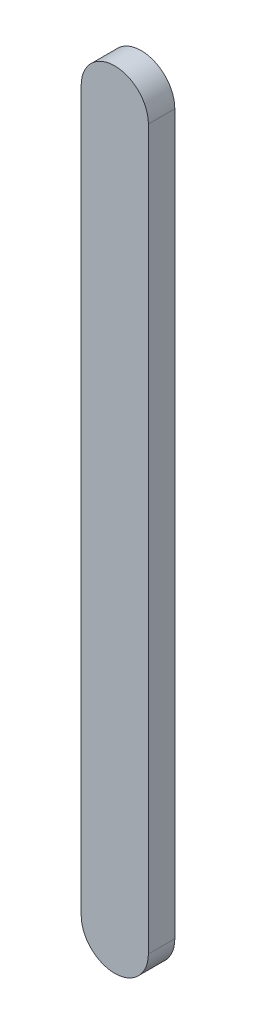
ISO-10303-21;
HEADER;
FILE_DESCRIPTION(('STEP AP214'),'2;1');
FILE_NAME('part.step','',(''),(''),'','','');
FILE_SCHEMA(('AUTOMOTIVE_DESIGN { 1 0 10303 214 1 1 1 1 }'));
ENDSEC;
DATA;
#1=APPLICATION_CONTEXT('core data for automotive mechanical design processes');
#2=APPLICATION_PROTOCOL_DEFINITION('international standard','automotive_design',2000,#1);
#3=PRODUCT_CONTEXT('',#1,'mechanical');
#4=PRODUCT('Part','Part','',(#3));
#5=PRODUCT_RELATED_PRODUCT_CATEGORY('part','',(#4));
#6=PRODUCT_DEFINITION_FORMATION('','',#4);
#7=PRODUCT_DEFINITION_CONTEXT('part definition',#1,'design');
#8=PRODUCT_DEFINITION('design','',#6,#7);
#9=PRODUCT_DEFINITION_SHAPE('','',#8);
#10=(LENGTH_UNIT() NAMED_UNIT(*) SI_UNIT(.MILLI.,.METRE.));
#11=(NAMED_UNIT(*) PLANE_ANGLE_UNIT() SI_UNIT($,.RADIAN.));
#12=(NAMED_UNIT(*) SI_UNIT($,.STERADIAN.) SOLID_ANGLE_UNIT());
#13=UNCERTAINTY_MEASURE_WITH_UNIT(LENGTH_MEASURE(1.E-05),#10,'distance_accuracy_value','');
#14=(GEOMETRIC_REPRESENTATION_CONTEXT(3) GLOBAL_UNCERTAINTY_ASSIGNED_CONTEXT((#13)) GLOBAL_UNIT_ASSIGNED_CONTEXT((#10,
#11,#12)) REPRESENTATION_CONTEXT('',''));
#15=CARTESIAN_POINT('',(0.,0.,0.));
#16=DIRECTION('',(0.,0.,1.));
#17=DIRECTION('',(1.,0.,0.));
#18=AXIS2_PLACEMENT_3D('',#15,#16,#17);
#19=CARTESIAN_POINT('',(109.855,61.8744,0.));
#20=DIRECTION('',(-1.,0.,0.));
#21=DIRECTION('',(0.,1.,0.));
#22=AXIS2_PLACEMENT_3D('',#19,#20,#21);
#23=PLANE('',#22);
#24=DIRECTION('',(0.,1.,0.));
#25=VECTOR('',#24,1.);
#26=CARTESIAN_POINT('',(109.855,61.8744,0.1999996));
#27=LINE('',#26,#25);
#28=CARTESIAN_POINT('',(109.855,61.8744,0.1999996));
#29=VERTEX_POINT('',#28);
#30=CARTESIAN_POINT('',(109.855,67.31,0.1999996));
#31=VERTEX_POINT('',#30);
#32=EDGE_CURVE('E11',#29,#31,#27,.T.);
#33=ORIENTED_EDGE('',*,*,#32,.F.);
#34=DIRECTION('',(0.,0.,1.));
#35=VECTOR('',#34,1.);
#36=CARTESIAN_POINT('',(109.855,61.8744,0.));
#37=LINE('',#36,#35);
#38=CARTESIAN_POINT('',(109.855,61.8744,0.));
#39=VERTEX_POINT('',#38);
#40=EDGE_CURVE('E24',#39,#29,#37,.T.);
#41=ORIENTED_EDGE('',*,*,#40,.F.);
#42=DIRECTION('',(0.,1.,0.));
#43=VECTOR('',#42,1.);
#44=CARTESIAN_POINT('',(109.855,61.8744,0.));
#45=LINE('',#44,#43);
#46=CARTESIAN_POINT('',(109.855,67.31,0.));
#47=VERTEX_POINT('',#46);
#48=EDGE_CURVE('E75',#39,#47,#45,.T.);
#49=ORIENTED_EDGE('',*,*,#48,.T.);
#50=DIRECTION('',(0.,0.,1.));
#51=VECTOR('',#50,1.);
#52=CARTESIAN_POINT('',(109.855,67.31,0.));
#53=LINE('',#52,#51);
#54=EDGE_CURVE('E37',#47,#31,#53,.T.);
#55=ORIENTED_EDGE('',*,*,#54,.T.);
#56=EDGE_LOOP('',(#33,#41,#49,#55));
#57=FACE_BOUND('',#56,.T.);
#58=ADVANCED_FACE('F17',(#57),#23,.F.);
#59=CARTESIAN_POINT('',(109.601,67.31,0.));
#60=DIRECTION('',(0.,0.,-1.));
#61=DIRECTION('',(1.,1.11896493820486E-13,0.));
#62=AXIS2_PLACEMENT_3D('',#59,#60,#61);
#63=CYLINDRICAL_SURFACE('',#62,0.25400000000001);
#64=CARTESIAN_POINT('',(109.601,67.31,0.1999996));
#65=DIRECTION('',(0.,0.,1.));
#66=DIRECTION('',(1.,1.11896493820486E-13,0.));
#67=AXIS2_PLACEMENT_3D('',#64,#65,#66);
#68=CIRCLE('',#67,0.25400000000001);
#69=CARTESIAN_POINT('',(109.347,67.31,0.1999996));
#70=VERTEX_POINT('',#69);
#71=EDGE_CURVE('E83',#31,#70,#68,.T.);
#72=ORIENTED_EDGE('',*,*,#71,.F.);
#73=ORIENTED_EDGE('',*,*,#54,.F.);
#74=CARTESIAN_POINT('',(109.601,67.31,0.));
#75=DIRECTION('',(0.,0.,1.));
#76=DIRECTION('',(1.,1.11896493820486E-13,0.));
#77=AXIS2_PLACEMENT_3D('',#74,#75,#76);
#78=CIRCLE('',#77,0.25400000000001);
#79=CARTESIAN_POINT('',(109.347,67.31,0.));
#80=VERTEX_POINT('',#79);
#81=EDGE_CURVE('E81',#47,#80,#78,.T.);
#82=ORIENTED_EDGE('',*,*,#81,.T.);
#83=DIRECTION('',(0.,0.,1.));
#84=VECTOR('',#83,1.);
#85=CARTESIAN_POINT('',(109.347,67.31,0.));
#86=LINE('',#85,#84);
#87=EDGE_CURVE('E67',#80,#70,#86,.T.);
#88=ORIENTED_EDGE('',*,*,#87,.T.);
#89=EDGE_LOOP('',(#72,#73,#82,#88));
#90=FACE_BOUND('',#89,.T.);
#91=ADVANCED_FACE('F89',(#90),#63,.T.);
#92=CARTESIAN_POINT('',(109.347,67.31,0.));
#93=DIRECTION('',(1.,0.,0.));
#94=DIRECTION('',(0.,-1.,0.));
#95=AXIS2_PLACEMENT_3D('',#92,#93,#94);
#96=PLANE('',#95);
#97=DIRECTION('',(0.,-1.,0.));
#98=VECTOR('',#97,1.);
#99=CARTESIAN_POINT('',(109.347,67.31,0.1999996));
#100=LINE('',#99,#98);
#101=CARTESIAN_POINT('',(109.347,61.8744,0.1999996));
#102=VERTEX_POINT('',#101);
#103=EDGE_CURVE('E71',#70,#102,#100,.T.);
#104=ORIENTED_EDGE('',*,*,#103,.F.);
#105=ORIENTED_EDGE('',*,*,#87,.F.);
#106=DIRECTION('',(0.,-1.,0.));
#107=VECTOR('',#106,1.);
#108=CARTESIAN_POINT('',(109.347,67.31,0.));
#109=LINE('',#108,#107);
#110=CARTESIAN_POINT('',(109.347,61.8744,0.));
#111=VERTEX_POINT('',#110);
#112=EDGE_CURVE('E63',#80,#111,#109,.T.);
#113=ORIENTED_EDGE('',*,*,#112,.T.);
#114=DIRECTION('',(0.,0.,1.));
#115=VECTOR('',#114,1.);
#116=CARTESIAN_POINT('',(109.347,61.8744,0.));
#117=LINE('',#116,#115);
#118=EDGE_CURVE('E53',#111,#102,#117,.T.);
#119=ORIENTED_EDGE('',*,*,#118,.T.);
#120=EDGE_LOOP('',(#104,#105,#113,#119));
#121=FACE_BOUND('',#120,.T.);
#122=ADVANCED_FACE('F66',(#121),#96,.F.);
#123=CARTESIAN_POINT('',(109.601,61.8744,0.));
#124=DIRECTION('',(0.,0.,-1.));
#125=DIRECTION('',(-1.,0.,0.));
#126=AXIS2_PLACEMENT_3D('',#123,#124,#125);
#127=CYLINDRICAL_SURFACE('',#126,0.254000000000007);
#128=CARTESIAN_POINT('',(109.601,61.8744,0.1999996));
#129=DIRECTION('',(0.,0.,1.));
#130=DIRECTION('',(-1.,0.,0.));
#131=AXIS2_PLACEMENT_3D('',#128,#129,#130);
#132=CIRCLE('',#131,0.254000000000007);
#133=EDGE_CURVE('E59',#102,#29,#132,.T.);
#134=ORIENTED_EDGE('',*,*,#133,.F.);
#135=ORIENTED_EDGE('',*,*,#118,.F.);
#136=CARTESIAN_POINT('',(109.601,61.8744,0.));
#137=DIRECTION('',(0.,0.,1.));
#138=DIRECTION('',(-1.,0.,0.));
#139=AXIS2_PLACEMENT_3D('',#136,#137,#138);
#140=CIRCLE('',#139,0.254000000000007);
#141=EDGE_CURVE('E57',#111,#39,#140,.T.);
#142=ORIENTED_EDGE('',*,*,#141,.T.);
#143=ORIENTED_EDGE('',*,*,#40,.T.);
#144=EDGE_LOOP('',(#134,#135,#142,#143));
#145=FACE_BOUND('',#144,.T.);
#146=ADVANCED_FACE('F55',(#145),#127,.T.);
#147=CARTESIAN_POINT('',(109.855,61.8744,0.));
#148=DIRECTION('',(0.,0.,-1.));
#149=DIRECTION('',(-1.,0.,0.));
#150=AXIS2_PLACEMENT_3D('',#147,#148,#149);
#151=PLANE('',#150);
#152=ORIENTED_EDGE('',*,*,#141,.F.);
#153=ORIENTED_EDGE('',*,*,#112,.F.);
#154=ORIENTED_EDGE('',*,*,#81,.F.);
#155=ORIENTED_EDGE('',*,*,#48,.F.);
#156=EDGE_LOOP('',(#152,#153,#154,#155));
#157=FACE_BOUND('',#156,.T.);
#158=ADVANCED_FACE('F74',(#157),#151,.T.);
#159=CARTESIAN_POINT('',(109.855,61.8744,0.1999996));
#160=DIRECTION('',(0.,0.,-1.));
#161=DIRECTION('',(-1.,0.,0.));
#162=AXIS2_PLACEMENT_3D('',#159,#160,#161);
#163=PLANE('',#162);
#164=ORIENTED_EDGE('',*,*,#32,.T.);
#165=ORIENTED_EDGE('',*,*,#71,.T.);
#166=ORIENTED_EDGE('',*,*,#103,.T.);
#167=ORIENTED_EDGE('',*,*,#133,.T.);
#168=EDGE_LOOP('',(#164,#165,#166,#167));
#169=FACE_BOUND('',#168,.T.);
#170=ADVANCED_FACE('F91',(#169),#163,.F.);
#171=CLOSED_SHELL('',(#58,#91,#122,#146,#158,#170));
#172=MANIFOLD_SOLID_BREP('B1',#171);
#173=ADVANCED_BREP_SHAPE_REPRESENTATION('',(#18,#172),#14);
#174=SHAPE_DEFINITION_REPRESENTATION(#9,#173);
ENDSEC;
END-ISO-10303-21;
